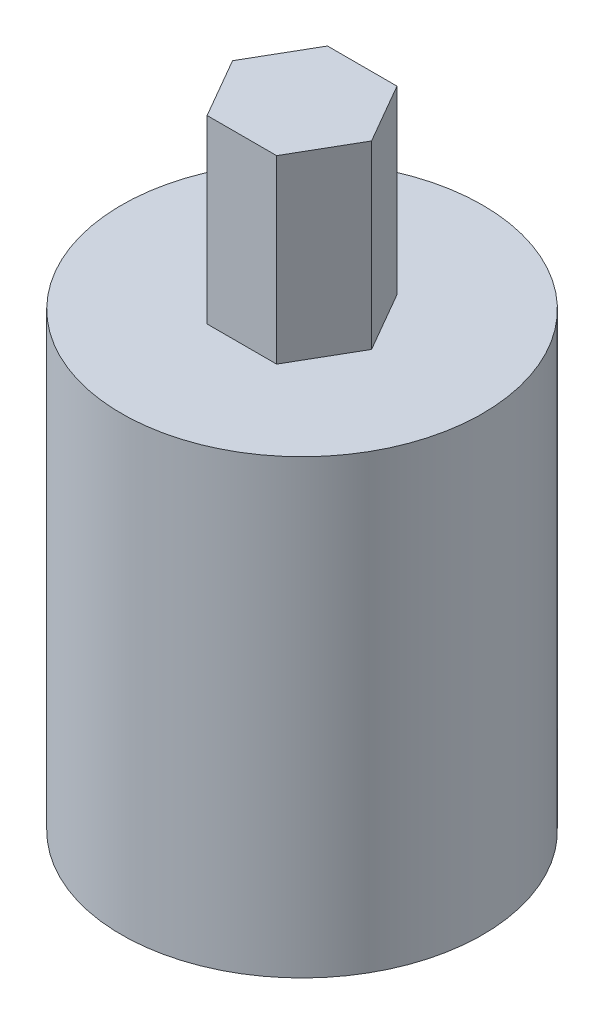
ISO-10303-21;
HEADER;
FILE_DESCRIPTION(('STEP AP214'),'2;1');
FILE_NAME('part.step','',(''),(''),'','','');
FILE_SCHEMA(('AUTOMOTIVE_DESIGN { 1 0 10303 214 1 1 1 1 }'));
ENDSEC;
DATA;
#1=APPLICATION_CONTEXT('core data for automotive mechanical design processes');
#2=APPLICATION_PROTOCOL_DEFINITION('international standard','automotive_design',2000,#1);
#3=PRODUCT_CONTEXT('',#1,'mechanical');
#4=PRODUCT('Part','Part','',(#3));
#5=PRODUCT_RELATED_PRODUCT_CATEGORY('part','',(#4));
#6=PRODUCT_DEFINITION_FORMATION('','',#4);
#7=PRODUCT_DEFINITION_CONTEXT('part definition',#1,'design');
#8=PRODUCT_DEFINITION('design','',#6,#7);
#9=PRODUCT_DEFINITION_SHAPE('','',#8);
#10=(LENGTH_UNIT() NAMED_UNIT(*) SI_UNIT(.MILLI.,.METRE.));
#11=(NAMED_UNIT(*) PLANE_ANGLE_UNIT() SI_UNIT($,.RADIAN.));
#12=(NAMED_UNIT(*) SI_UNIT($,.STERADIAN.) SOLID_ANGLE_UNIT());
#13=UNCERTAINTY_MEASURE_WITH_UNIT(LENGTH_MEASURE(1.E-05),#10,'distance_accuracy_value','');
#14=(GEOMETRIC_REPRESENTATION_CONTEXT(3) GLOBAL_UNCERTAINTY_ASSIGNED_CONTEXT((#13)) GLOBAL_UNIT_ASSIGNED_CONTEXT((#10,
#11,#12)) REPRESENTATION_CONTEXT('',''));
#15=CARTESIAN_POINT('',(0.,0.,0.));
#16=DIRECTION('',(0.,0.,1.));
#17=DIRECTION('',(1.,0.,0.));
#18=AXIS2_PLACEMENT_3D('',#15,#16,#17);
#19=CARTESIAN_POINT('',(0.,-7.5,0.));
#20=DIRECTION('',(0.,-1.,0.));
#21=DIRECTION('',(0.,0.,-1.));
#22=AXIS2_PLACEMENT_3D('',#19,#20,#21);
#23=PLANE('',#22);
#24=CARTESIAN_POINT('',(0.,-7.5,0.));
#25=DIRECTION('',(0.,-1.,0.));
#26=DIRECTION('',(0.,0.,-1.));
#27=AXIS2_PLACEMENT_3D('',#24,#25,#26);
#28=CIRCLE('',#27,3.);
#29=CARTESIAN_POINT('',(0.,-7.5,-3.));
#30=VERTEX_POINT('',#29);
#31=EDGE_CURVE('E14',#30,#30,#28,.T.);
#32=ORIENTED_EDGE('',*,*,#31,.T.);
#33=EDGE_LOOP('',(#32));
#34=FACE_BOUND('',#33,.T.);
#35=DIRECTION('',(0.,0.,-1.));
#36=VECTOR('',#35,1.);
#37=CARTESIAN_POINT('',(-1.13002976164114,-7.5,0.));
#38=LINE('',#37,#36);
#39=CARTESIAN_POINT('',(-1.13002976164114,-7.5,-1.13002976164114));
#40=VERTEX_POINT('',#39);
#41=CARTESIAN_POINT('',(-1.13002976164115,-7.5,-2.23002976164114));
#42=VERTEX_POINT('',#41);
#43=EDGE_CURVE('E252',#40,#42,#38,.T.);
#44=ORIENTED_EDGE('',*,*,#43,.F.);
#45=DIRECTION('',(-1.,0.,0.));
#46=VECTOR('',#45,1.);
#47=CARTESIAN_POINT('',(0.,-7.5,-1.13002976164114));
#48=LINE('',#47,#46);
#49=CARTESIAN_POINT('',(-2.23002976164115,-7.5,-1.13002976164114));
#50=VERTEX_POINT('',#49);
#51=EDGE_CURVE('E240',#40,#50,#48,.T.);
#52=ORIENTED_EDGE('',*,*,#51,.T.);
#53=CARTESIAN_POINT('',(0.,-7.5,0.));
#54=DIRECTION('',(0.,-1.,0.));
#55=DIRECTION('',(0.,0.,-1.));
#56=AXIS2_PLACEMENT_3D('',#53,#54,#55);
#57=CIRCLE('',#56,2.5);
#58=CARTESIAN_POINT('',(-2.23002976164115,-7.5,1.13002976164115));
#59=VERTEX_POINT('',#58);
#60=EDGE_CURVE('E310',#59,#50,#57,.T.);
#61=ORIENTED_EDGE('',*,*,#60,.F.);
#62=DIRECTION('',(-1.,0.,0.));
#63=VECTOR('',#62,1.);
#64=CARTESIAN_POINT('',(0.,-7.5,1.13002976164114));
#65=LINE('',#64,#63);
#66=CARTESIAN_POINT('',(-1.13002976164114,-7.5,1.13002976164114));
#67=VERTEX_POINT('',#66);
#68=EDGE_CURVE('E239',#67,#59,#65,.T.);
#69=ORIENTED_EDGE('',*,*,#68,.F.);
#70=CARTESIAN_POINT('',(-1.13002976164114,-7.5,2.23002976164114));
#71=VERTEX_POINT('',#70);
#72=EDGE_CURVE('E235',#71,#67,#38,.T.);
#73=ORIENTED_EDGE('',*,*,#72,.F.);
#74=CARTESIAN_POINT('',(0.,-7.5,0.));
#75=DIRECTION('',(0.,-1.,0.));
#76=DIRECTION('',(0.,0.,-1.));
#77=AXIS2_PLACEMENT_3D('',#74,#75,#76);
#78=CIRCLE('',#77,2.5);
#79=CARTESIAN_POINT('',(1.13002976164114,-7.5,2.23002976164114));
#80=VERTEX_POINT('',#79);
#81=EDGE_CURVE('E305',#80,#71,#78,.T.);
#82=ORIENTED_EDGE('',*,*,#81,.F.);
#83=DIRECTION('',(0.,0.,-1.));
#84=VECTOR('',#83,1.);
#85=CARTESIAN_POINT('',(1.13002976164114,-7.5,0.));
#86=LINE('',#85,#84);
#87=CARTESIAN_POINT('',(1.13002976164114,-7.5,1.13002976164114));
#88=VERTEX_POINT('',#87);
#89=EDGE_CURVE('E234',#80,#88,#86,.T.);
#90=ORIENTED_EDGE('',*,*,#89,.T.);
#91=CARTESIAN_POINT('',(2.23002976164114,-7.5,1.13002976164114));
#92=VERTEX_POINT('',#91);
#93=EDGE_CURVE('E140',#92,#88,#65,.T.);
#94=ORIENTED_EDGE('',*,*,#93,.F.);
#95=CARTESIAN_POINT('',(0.,-7.5,0.));
#96=DIRECTION('',(0.,-1.,0.));
#97=DIRECTION('',(0.,0.,-1.));
#98=AXIS2_PLACEMENT_3D('',#95,#96,#97);
#99=CIRCLE('',#98,2.5);
#100=CARTESIAN_POINT('',(2.23002976164114,-7.5,-1.13002976164114));
#101=VERTEX_POINT('',#100);
#102=EDGE_CURVE('E224',#101,#92,#99,.T.);
#103=ORIENTED_EDGE('',*,*,#102,.F.);
#104=CARTESIAN_POINT('',(1.13002976164114,-7.5,-1.13002976164114));
#105=VERTEX_POINT('',#104);
#106=EDGE_CURVE('E217',#101,#105,#48,.T.);
#107=ORIENTED_EDGE('',*,*,#106,.T.);
#108=CARTESIAN_POINT('',(1.13002976164115,-7.5,-2.23002976164114));
#109=VERTEX_POINT('',#108);
#110=EDGE_CURVE('E228',#105,#109,#86,.T.);
#111=ORIENTED_EDGE('',*,*,#110,.T.);
#112=CARTESIAN_POINT('',(0.,-7.5,0.));
#113=DIRECTION('',(0.,-1.,0.));
#114=DIRECTION('',(0.,0.,-1.));
#115=AXIS2_PLACEMENT_3D('',#112,#113,#114);
#116=CIRCLE('',#115,2.5);
#117=EDGE_CURVE('E318',#42,#109,#116,.T.);
#118=ORIENTED_EDGE('',*,*,#117,.F.);
#119=EDGE_LOOP('',(#44,#52,#61,#69,#73,#82,#90,#94,#103,#107,#111,#118));
#120=FACE_BOUND('',#119,.T.);
#121=ADVANCED_FACE('F125',(#34,#120),#23,.T.);
#122=CARTESIAN_POINT('',(0.,-7.5,0.));
#123=DIRECTION('',(0.,1.,0.));
#124=DIRECTION('',(0.,0.,1.));
#125=AXIS2_PLACEMENT_3D('',#122,#123,#124);
#126=CYLINDRICAL_SURFACE('',#125,3.);
#127=ORIENTED_EDGE('',*,*,#31,.F.);
#128=EDGE_LOOP('',(#127));
#129=FACE_BOUND('',#128,.T.);
#130=CARTESIAN_POINT('',(0.,0.,0.));
#131=DIRECTION('',(0.,-1.,0.));
#132=DIRECTION('',(0.,0.,-1.));
#133=AXIS2_PLACEMENT_3D('',#130,#131,#132);
#134=CIRCLE('',#133,3.);
#135=CARTESIAN_POINT('',(0.,0.,-3.));
#136=VERTEX_POINT('',#135);
#137=EDGE_CURVE('E129',#136,#136,#134,.T.);
#138=ORIENTED_EDGE('',*,*,#137,.T.);
#139=EDGE_LOOP('',(#138));
#140=FACE_BOUND('',#139,.T.);
#141=ADVANCED_FACE('F127',(#129,#140),#126,.T.);
#142=CARTESIAN_POINT('',(0.,0.,0.));
#143=DIRECTION('',(0.,-1.,0.));
#144=DIRECTION('',(0.,0.,-1.));
#145=AXIS2_PLACEMENT_3D('',#142,#143,#144);
#146=PLANE('',#145);
#147=ORIENTED_EDGE('',*,*,#137,.F.);
#148=EDGE_LOOP('',(#147));
#149=FACE_BOUND('',#148,.T.);
#150=ADVANCED_FACE('F345',(#149),#146,.F.);
#151=CARTESIAN_POINT('',(0.,5.,0.));
#152=DIRECTION('',(0.,-1.,0.));
#153=DIRECTION('',(0.,0.,-1.));
#154=AXIS2_PLACEMENT_3D('',#151,#152,#153);
#155=CYLINDRICAL_SURFACE('',#154,2.5);
#156=CARTESIAN_POINT('',(0.,-1.,0.));
#157=DIRECTION('',(0.,-1.,0.));
#158=DIRECTION('',(0.,0.,-1.));
#159=AXIS2_PLACEMENT_3D('',#156,#157,#158);
#160=CIRCLE('',#159,2.5);
#161=CARTESIAN_POINT('',(-1.13002976164114,-1.,2.23002976164114));
#162=VERTEX_POINT('',#161);
#163=CARTESIAN_POINT('',(1.13002976164114,-1.,2.23002976164114));
#164=VERTEX_POINT('',#163);
#165=EDGE_CURVE('E293',#162,#164,#160,.F.);
#166=ORIENTED_EDGE('',*,*,#165,.T.);
#167=DIRECTION('',(0.,-1.,0.));
#168=VECTOR('',#167,1.);
#169=CARTESIAN_POINT('',(1.13002976164114,5.,2.23002976164114));
#170=LINE('',#169,#168);
#171=EDGE_CURVE('E299',#164,#80,#170,.T.);
#172=ORIENTED_EDGE('',*,*,#171,.T.);
#173=ORIENTED_EDGE('',*,*,#81,.T.);
#174=DIRECTION('',(0.,-1.,0.));
#175=VECTOR('',#174,1.);
#176=CARTESIAN_POINT('',(-1.13002976164114,5.,2.23002976164114));
#177=LINE('',#176,#175);
#178=EDGE_CURVE('E149',#162,#71,#177,.T.);
#179=ORIENTED_EDGE('',*,*,#178,.F.);
#180=EDGE_LOOP('',(#166,#172,#173,#179));
#181=FACE_BOUND('',#180,.T.);
#182=ADVANCED_FACE('F298',(#181),#155,.F.);
#183=CARTESIAN_POINT('',(0.,-1.,0.));
#184=DIRECTION('',(0.,-1.,0.));
#185=DIRECTION('',(0.,0.,-1.));
#186=AXIS2_PLACEMENT_3D('',#183,#184,#185);
#187=PLANE('',#186);
#188=ORIENTED_EDGE('',*,*,#165,.F.);
#189=DIRECTION('',(0.,0.,1.));
#190=VECTOR('',#189,1.);
#191=CARTESIAN_POINT('',(-1.13002976164114,-1.,0.));
#192=LINE('',#191,#190);
#193=CARTESIAN_POINT('',(-1.13002976164114,-1.,1.13002976164114));
#194=VERTEX_POINT('',#193);
#195=EDGE_CURVE('E279',#194,#162,#192,.T.);
#196=ORIENTED_EDGE('',*,*,#195,.F.);
#197=DIRECTION('',(1.,0.,0.));
#198=VECTOR('',#197,1.);
#199=CARTESIAN_POINT('',(0.,-1.,1.13002976164114));
#200=LINE('',#199,#198);
#201=CARTESIAN_POINT('',(-2.23002976164115,-1.,1.13002976164115));
#202=VERTEX_POINT('',#201);
#203=EDGE_CURVE('E249',#202,#194,#200,.T.);
#204=ORIENTED_EDGE('',*,*,#203,.F.);
#205=CARTESIAN_POINT('',(0.,-1.,0.));
#206=DIRECTION('',(0.,-1.,0.));
#207=DIRECTION('',(0.,0.,-1.));
#208=AXIS2_PLACEMENT_3D('',#205,#206,#207);
#209=CIRCLE('',#208,2.5);
#210=CARTESIAN_POINT('',(-2.23002976164115,-1.,-1.13002976164114));
#211=VERTEX_POINT('',#210);
#212=EDGE_CURVE('E276',#211,#202,#209,.F.);
#213=ORIENTED_EDGE('',*,*,#212,.F.);
#214=DIRECTION('',(1.,0.,0.));
#215=VECTOR('',#214,1.);
#216=CARTESIAN_POINT('',(0.,-1.,-1.13002976164114));
#217=LINE('',#216,#215);
#218=CARTESIAN_POINT('',(-1.13002976164114,-1.,-1.13002976164114));
#219=VERTEX_POINT('',#218);
#220=EDGE_CURVE('E246',#211,#219,#217,.T.);
#221=ORIENTED_EDGE('',*,*,#220,.T.);
#222=CARTESIAN_POINT('',(-1.13002976164115,-1.,-2.23002976164114));
#223=VERTEX_POINT('',#222);
#224=EDGE_CURVE('E257',#223,#219,#192,.T.);
#225=ORIENTED_EDGE('',*,*,#224,.F.);
#226=CARTESIAN_POINT('',(0.,-1.,0.));
#227=DIRECTION('',(0.,-1.,0.));
#228=DIRECTION('',(0.,0.,-1.));
#229=AXIS2_PLACEMENT_3D('',#226,#227,#228);
#230=CIRCLE('',#229,2.5);
#231=CARTESIAN_POINT('',(1.13002976164115,-1.,-2.23002976164114));
#232=VERTEX_POINT('',#231);
#233=EDGE_CURVE('E314',#232,#223,#230,.F.);
#234=ORIENTED_EDGE('',*,*,#233,.F.);
#235=DIRECTION('',(0.,0.,1.));
#236=VECTOR('',#235,1.);
#237=CARTESIAN_POINT('',(1.13002976164114,-1.,0.));
#238=LINE('',#237,#236);
#239=CARTESIAN_POINT('',(1.13002976164114,-1.,-1.13002976164114));
#240=VERTEX_POINT('',#239);
#241=EDGE_CURVE('E281',#232,#240,#238,.T.);
#242=ORIENTED_EDGE('',*,*,#241,.T.);
#243=CARTESIAN_POINT('',(2.23002976164114,-1.,-1.13002976164114));
#244=VERTEX_POINT('',#243);
#245=EDGE_CURVE('E220',#240,#244,#217,.T.);
#246=ORIENTED_EDGE('',*,*,#245,.T.);
#247=CARTESIAN_POINT('',(0.,-1.,0.));
#248=DIRECTION('',(0.,-1.,0.));
#249=DIRECTION('',(0.,0.,-1.));
#250=AXIS2_PLACEMENT_3D('',#247,#248,#249);
#251=CIRCLE('',#250,2.5);
#252=CARTESIAN_POINT('',(2.23002976164114,-1.,1.13002976164114));
#253=VERTEX_POINT('',#252);
#254=EDGE_CURVE('E320',#253,#244,#251,.F.);
#255=ORIENTED_EDGE('',*,*,#254,.F.);
#256=CARTESIAN_POINT('',(1.13002976164114,-1.,1.13002976164114));
#257=VERTEX_POINT('',#256);
#258=EDGE_CURVE('E253',#257,#253,#200,.T.);
#259=ORIENTED_EDGE('',*,*,#258,.F.);
#260=EDGE_CURVE('E288',#257,#164,#238,.T.);
#261=ORIENTED_EDGE('',*,*,#260,.T.);
#262=EDGE_LOOP('',(#188,#196,#204,#213,#221,#225,#234,#242,#246,#255,#259,#261));
#263=FACE_BOUND('',#262,.T.);
#264=ADVANCED_FACE('F271',(#263),#187,.T.);
#265=CARTESIAN_POINT('',(0.,5.,0.));
#266=DIRECTION('',(0.,-1.,0.));
#267=DIRECTION('',(0.,0.,-1.));
#268=AXIS2_PLACEMENT_3D('',#265,#266,#267);
#269=CYLINDRICAL_SURFACE('',#268,2.5);
#270=ORIENTED_EDGE('',*,*,#233,.T.);
#271=DIRECTION('',(0.,-1.,0.));
#272=VECTOR('',#271,1.);
#273=CARTESIAN_POINT('',(-1.13002976164115,5.,-2.23002976164114));
#274=LINE('',#273,#272);
#275=EDGE_CURVE('E278',#223,#42,#274,.T.);
#276=ORIENTED_EDGE('',*,*,#275,.T.);
#277=ORIENTED_EDGE('',*,*,#117,.T.);
#278=DIRECTION('',(0.,-1.,0.));
#279=VECTOR('',#278,1.);
#280=CARTESIAN_POINT('',(1.13002976164115,5.,-2.23002976164114));
#281=LINE('',#280,#279);
#282=EDGE_CURVE('E230',#232,#109,#281,.T.);
#283=ORIENTED_EDGE('',*,*,#282,.F.);
#284=EDGE_LOOP('',(#270,#276,#277,#283));
#285=FACE_BOUND('',#284,.T.);
#286=ADVANCED_FACE('F342',(#285),#269,.F.);
#287=CARTESIAN_POINT('',(0.,5.,-1.13002976164114));
#288=DIRECTION('',(0.,0.,1.));
#289=DIRECTION('',(1.,0.,0.));
#290=AXIS2_PLACEMENT_3D('',#287,#288,#289);
#291=PLANE('',#290);
#292=DIRECTION('',(0.,1.,0.));
#293=VECTOR('',#292,1.);
#294=CARTESIAN_POINT('',(-1.13002976164114,5.,-1.13002976164114));
#295=LINE('',#294,#293);
#296=EDGE_CURVE('E256',#40,#219,#295,.T.);
#297=ORIENTED_EDGE('',*,*,#296,.T.);
#298=ORIENTED_EDGE('',*,*,#220,.F.);
#299=DIRECTION('',(0.,-1.,0.));
#300=VECTOR('',#299,1.);
#301=CARTESIAN_POINT('',(-2.23002976164115,5.,-1.13002976164114));
#302=LINE('',#301,#300);
#303=EDGE_CURVE('E313',#211,#50,#302,.T.);
#304=ORIENTED_EDGE('',*,*,#303,.T.);
#305=ORIENTED_EDGE('',*,*,#51,.F.);
#306=EDGE_LOOP('',(#297,#298,#304,#305));
#307=FACE_BOUND('',#306,.T.);
#308=ADVANCED_FACE('F263',(#307),#291,.T.);
#309=CARTESIAN_POINT('',(-1.13002976164114,5.,0.));
#310=DIRECTION('',(-1.,0.,0.));
#311=DIRECTION('',(0.,0.,1.));
#312=AXIS2_PLACEMENT_3D('',#309,#310,#311);
#313=PLANE('',#312);
#314=ORIENTED_EDGE('',*,*,#43,.T.);
#315=ORIENTED_EDGE('',*,*,#275,.F.);
#316=ORIENTED_EDGE('',*,*,#224,.T.);
#317=ORIENTED_EDGE('',*,*,#296,.F.);
#318=EDGE_LOOP('',(#314,#315,#316,#317));
#319=FACE_BOUND('',#318,.T.);
#320=ADVANCED_FACE('F277',(#319),#313,.F.);
#321=CARTESIAN_POINT('',(1.13002976164114,5.,0.));
#322=DIRECTION('',(-1.,0.,0.));
#323=DIRECTION('',(0.,0.,1.));
#324=AXIS2_PLACEMENT_3D('',#321,#322,#323);
#325=PLANE('',#324);
#326=DIRECTION('',(0.,1.,0.));
#327=VECTOR('',#326,1.);
#328=CARTESIAN_POINT('',(1.13002976164114,5.,-1.13002976164114));
#329=LINE('',#328,#327);
#330=EDGE_CURVE('E213',#105,#240,#329,.T.);
#331=ORIENTED_EDGE('',*,*,#330,.T.);
#332=ORIENTED_EDGE('',*,*,#241,.F.);
#333=ORIENTED_EDGE('',*,*,#282,.T.);
#334=ORIENTED_EDGE('',*,*,#110,.F.);
#335=EDGE_LOOP('',(#331,#332,#333,#334));
#336=FACE_BOUND('',#335,.T.);
#337=ADVANCED_FACE('F229',(#336),#325,.T.);
#338=ORIENTED_EDGE('',*,*,#106,.F.);
#339=DIRECTION('',(0.,-1.,0.));
#340=VECTOR('',#339,1.);
#341=CARTESIAN_POINT('',(2.23002976164114,5.,-1.13002976164114));
#342=LINE('',#341,#340);
#343=EDGE_CURVE('E325',#244,#101,#342,.T.);
#344=ORIENTED_EDGE('',*,*,#343,.F.);
#345=ORIENTED_EDGE('',*,*,#245,.F.);
#346=ORIENTED_EDGE('',*,*,#330,.F.);
#347=EDGE_LOOP('',(#338,#344,#345,#346));
#348=FACE_BOUND('',#347,.T.);
#349=ADVANCED_FACE('F215',(#348),#291,.T.);
#350=CARTESIAN_POINT('',(0.,5.,0.));
#351=DIRECTION('',(0.,-1.,0.));
#352=DIRECTION('',(0.,0.,-1.));
#353=AXIS2_PLACEMENT_3D('',#350,#351,#352);
#354=CYLINDRICAL_SURFACE('',#353,2.5);
#355=ORIENTED_EDGE('',*,*,#254,.T.);
#356=ORIENTED_EDGE('',*,*,#343,.T.);
#357=ORIENTED_EDGE('',*,*,#102,.T.);
#358=DIRECTION('',(0.,-1.,0.));
#359=VECTOR('',#358,1.);
#360=CARTESIAN_POINT('',(2.23002976164114,5.,1.13002976164114));
#361=LINE('',#360,#359);
#362=EDGE_CURVE('E284',#253,#92,#361,.T.);
#363=ORIENTED_EDGE('',*,*,#362,.F.);
#364=EDGE_LOOP('',(#355,#356,#357,#363));
#365=FACE_BOUND('',#364,.T.);
#366=ADVANCED_FACE('F328',(#365),#354,.F.);
#367=CARTESIAN_POINT('',(0.,5.,0.));
#368=DIRECTION('',(0.,-1.,0.));
#369=DIRECTION('',(0.,0.,-1.));
#370=AXIS2_PLACEMENT_3D('',#367,#368,#369);
#371=CYLINDRICAL_SURFACE('',#370,2.5);
#372=ORIENTED_EDGE('',*,*,#212,.T.);
#373=DIRECTION('',(0.,-1.,0.));
#374=VECTOR('',#373,1.);
#375=CARTESIAN_POINT('',(-2.23002976164115,5.,1.13002976164115));
#376=LINE('',#375,#374);
#377=EDGE_CURVE('E309',#202,#59,#376,.T.);
#378=ORIENTED_EDGE('',*,*,#377,.T.);
#379=ORIENTED_EDGE('',*,*,#60,.T.);
#380=ORIENTED_EDGE('',*,*,#303,.F.);
#381=EDGE_LOOP('',(#372,#378,#379,#380));
#382=FACE_BOUND('',#381,.T.);
#383=ADVANCED_FACE('F340',(#382),#371,.F.);
#384=CARTESIAN_POINT('',(0.,5.,1.13002976164114));
#385=DIRECTION('',(0.,0.,1.));
#386=DIRECTION('',(1.,0.,0.));
#387=AXIS2_PLACEMENT_3D('',#384,#385,#386);
#388=PLANE('',#387);
#389=DIRECTION('',(0.,1.,0.));
#390=VECTOR('',#389,1.);
#391=CARTESIAN_POINT('',(1.13002976164114,5.,1.13002976164114));
#392=LINE('',#391,#390);
#393=EDGE_CURVE('E225',#88,#257,#392,.T.);
#394=ORIENTED_EDGE('',*,*,#393,.T.);
#395=ORIENTED_EDGE('',*,*,#258,.T.);
#396=ORIENTED_EDGE('',*,*,#362,.T.);
#397=ORIENTED_EDGE('',*,*,#93,.T.);
#398=EDGE_LOOP('',(#394,#395,#396,#397));
#399=FACE_BOUND('',#398,.T.);
#400=ADVANCED_FACE('F327',(#399),#388,.F.);
#401=ORIENTED_EDGE('',*,*,#68,.T.);
#402=ORIENTED_EDGE('',*,*,#377,.F.);
#403=ORIENTED_EDGE('',*,*,#203,.T.);
#404=DIRECTION('',(0.,1.,0.));
#405=VECTOR('',#404,1.);
#406=CARTESIAN_POINT('',(-1.13002976164114,5.,1.13002976164114));
#407=LINE('',#406,#405);
#408=EDGE_CURVE('E254',#67,#194,#407,.T.);
#409=ORIENTED_EDGE('',*,*,#408,.F.);
#410=EDGE_LOOP('',(#401,#402,#403,#409));
#411=FACE_BOUND('',#410,.T.);
#412=ADVANCED_FACE('F338',(#411),#388,.F.);
#413=ORIENTED_EDGE('',*,*,#408,.T.);
#414=ORIENTED_EDGE('',*,*,#195,.T.);
#415=ORIENTED_EDGE('',*,*,#178,.T.);
#416=ORIENTED_EDGE('',*,*,#72,.T.);
#417=EDGE_LOOP('',(#413,#414,#415,#416));
#418=FACE_BOUND('',#417,.T.);
#419=ADVANCED_FACE('F334',(#418),#313,.F.);
#420=ORIENTED_EDGE('',*,*,#89,.F.);
#421=ORIENTED_EDGE('',*,*,#171,.F.);
#422=ORIENTED_EDGE('',*,*,#260,.F.);
#423=ORIENTED_EDGE('',*,*,#393,.F.);
#424=EDGE_LOOP('',(#420,#421,#422,#423));
#425=FACE_BOUND('',#424,.T.);
#426=ADVANCED_FACE('F331',(#425),#325,.T.);
#427=CLOSED_SHELL('',(#121,#141,#150,#182,#264,#286,#308,#320,#337,#349,#366,#383,#400,#412,
#419,#426));
#428=MANIFOLD_SOLID_BREP('B2',#427);
#429=CARTESIAN_POINT('',(0.577350269189624,3.,-1.));
#430=DIRECTION('',(0.,0.,1.));
#431=DIRECTION('',(1.,0.,0.));
#432=AXIS2_PLACEMENT_3D('',#429,#430,#431);
#433=PLANE('',#432);
#434=DIRECTION('',(-1.,0.,0.));
#435=VECTOR('',#434,1.);
#436=CARTESIAN_POINT('',(0.577350269189624,0.,-1.));
#437=LINE('',#436,#435);
#438=CARTESIAN_POINT('',(0.577350269189624,0.,-1.));
#439=VERTEX_POINT('',#438);
#440=CARTESIAN_POINT('',(-0.577350269189623,0.,-1.));
#441=VERTEX_POINT('',#440);
#442=EDGE_CURVE('E559',#439,#441,#437,.T.);
#443=ORIENTED_EDGE('',*,*,#442,.T.);
#444=DIRECTION('',(0.,-1.,0.));
#445=VECTOR('',#444,1.);
#446=CARTESIAN_POINT('',(-0.577350269189623,3.,-1.));
#447=LINE('',#446,#445);
#448=CARTESIAN_POINT('',(-0.577350269189623,3.,-1.));
#449=VERTEX_POINT('',#448);
#450=EDGE_CURVE('E123',#449,#441,#447,.T.);
#451=ORIENTED_EDGE('',*,*,#450,.F.);
#452=DIRECTION('',(-1.,0.,0.));
#453=VECTOR('',#452,1.);
#454=CARTESIAN_POINT('',(0.577350269189624,3.,-1.));
#455=LINE('',#454,#453);
#456=CARTESIAN_POINT('',(0.577350269189624,3.,-1.));
#457=VERTEX_POINT('',#456);
#458=EDGE_CURVE('E569',#457,#449,#455,.T.);
#459=ORIENTED_EDGE('',*,*,#458,.F.);
#460=DIRECTION('',(0.,-1.,0.));
#461=VECTOR('',#460,1.);
#462=CARTESIAN_POINT('',(0.577350269189624,3.,-1.));
#463=LINE('',#462,#461);
#464=EDGE_CURVE('E555',#457,#439,#463,.T.);
#465=ORIENTED_EDGE('',*,*,#464,.T.);
#466=EDGE_LOOP('',(#443,#451,#459,#465));
#467=FACE_BOUND('',#466,.T.);
#468=ADVANCED_FACE('F475',(#467),#433,.F.);
#469=CARTESIAN_POINT('',(-0.577350269189623,3.,-1.));
#470=DIRECTION('',(0.866025403784439,0.,0.5));
#471=DIRECTION('',(0.5,0.,-0.866025403784439));
#472=AXIS2_PLACEMENT_3D('',#469,#470,#471);
#473=PLANE('',#472);
#474=DIRECTION('',(-0.5,0.,0.866025403784439));
#475=VECTOR('',#474,1.);
#476=CARTESIAN_POINT('',(-0.577350269189623,0.,-1.));
#477=LINE('',#476,#475);
#478=CARTESIAN_POINT('',(-1.15470053837925,0.,0.));
#479=VERTEX_POINT('',#478);
#480=EDGE_CURVE('E562',#441,#479,#477,.T.);
#481=ORIENTED_EDGE('',*,*,#480,.T.);
#482=DIRECTION('',(0.,-1.,0.));
#483=VECTOR('',#482,1.);
#484=CARTESIAN_POINT('',(-1.15470053837925,3.,0.));
#485=LINE('',#484,#483);
#486=CARTESIAN_POINT('',(-1.15470053837925,3.,0.));
#487=VERTEX_POINT('',#486);
#488=EDGE_CURVE('E483',#487,#479,#485,.T.);
#489=ORIENTED_EDGE('',*,*,#488,.F.);
#490=DIRECTION('',(-0.5,0.,0.866025403784439));
#491=VECTOR('',#490,1.);
#492=CARTESIAN_POINT('',(-0.577350269189623,3.,-1.));
#493=LINE('',#492,#491);
#494=EDGE_CURVE('E528',#449,#487,#493,.T.);
#495=ORIENTED_EDGE('',*,*,#494,.F.);
#496=ORIENTED_EDGE('',*,*,#450,.T.);
#497=EDGE_LOOP('',(#481,#489,#495,#496));
#498=FACE_BOUND('',#497,.T.);
#499=ADVANCED_FACE('F593',(#498),#473,.F.);
#500=CARTESIAN_POINT('',(-1.15470053837925,3.,0.));
#501=DIRECTION('',(0.866025403784439,0.,-0.5));
#502=DIRECTION('',(-0.5,0.,-0.866025403784439));
#503=AXIS2_PLACEMENT_3D('',#500,#501,#502);
#504=PLANE('',#503);
#505=DIRECTION('',(0.5,0.,0.866025403784438));
#506=VECTOR('',#505,1.);
#507=CARTESIAN_POINT('',(-1.15470053837925,0.,0.));
#508=LINE('',#507,#506);
#509=CARTESIAN_POINT('',(-0.577350269189619,0.,0.999999999999997));
#510=VERTEX_POINT('',#509);
#511=EDGE_CURVE('E564',#479,#510,#508,.T.);
#512=ORIENTED_EDGE('',*,*,#511,.T.);
#513=DIRECTION('',(0.,-1.,0.));
#514=VECTOR('',#513,1.);
#515=CARTESIAN_POINT('',(-0.577350269189619,3.,0.999999999999997));
#516=LINE('',#515,#514);
#517=CARTESIAN_POINT('',(-0.577350269189619,3.,0.999999999999997));
#518=VERTEX_POINT('',#517);
#519=EDGE_CURVE('E550',#518,#510,#516,.T.);
#520=ORIENTED_EDGE('',*,*,#519,.F.);
#521=DIRECTION('',(0.5,0.,0.866025403784438));
#522=VECTOR('',#521,1.);
#523=CARTESIAN_POINT('',(-1.15470053837925,3.,0.));
#524=LINE('',#523,#522);
#525=EDGE_CURVE('E541',#487,#518,#524,.T.);
#526=ORIENTED_EDGE('',*,*,#525,.F.);
#527=ORIENTED_EDGE('',*,*,#488,.T.);
#528=EDGE_LOOP('',(#512,#520,#526,#527));
#529=FACE_BOUND('',#528,.T.);
#530=ADVANCED_FACE('F575',(#529),#504,.F.);
#531=CARTESIAN_POINT('',(-0.577350269189619,3.,0.999999999999997));
#532=DIRECTION('',(0.,0.,-1.));
#533=DIRECTION('',(-1.,0.,0.));
#534=AXIS2_PLACEMENT_3D('',#531,#532,#533);
#535=PLANE('',#534);
#536=DIRECTION('',(1.,0.,0.));
#537=VECTOR('',#536,1.);
#538=CARTESIAN_POINT('',(-0.577350269189619,0.,0.999999999999997));
#539=LINE('',#538,#537);
#540=CARTESIAN_POINT('',(0.577350269189625,0.,0.999999999999996));
#541=VERTEX_POINT('',#540);
#542=EDGE_CURVE('E549',#510,#541,#539,.T.);
#543=ORIENTED_EDGE('',*,*,#542,.T.);
#544=DIRECTION('',(0.,-1.,0.));
#545=VECTOR('',#544,1.);
#546=CARTESIAN_POINT('',(0.577350269189625,3.,0.999999999999996));
#547=LINE('',#546,#545);
#548=CARTESIAN_POINT('',(0.577350269189625,3.,0.999999999999996));
#549=VERTEX_POINT('',#548);
#550=EDGE_CURVE('E546',#549,#541,#547,.T.);
#551=ORIENTED_EDGE('',*,*,#550,.F.);
#552=DIRECTION('',(1.,0.,0.));
#553=VECTOR('',#552,1.);
#554=CARTESIAN_POINT('',(-0.577350269189619,3.,0.999999999999997));
#555=LINE('',#554,#553);
#556=EDGE_CURVE('E535',#518,#549,#555,.T.);
#557=ORIENTED_EDGE('',*,*,#556,.F.);
#558=ORIENTED_EDGE('',*,*,#519,.T.);
#559=EDGE_LOOP('',(#543,#551,#557,#558));
#560=FACE_BOUND('',#559,.T.);
#561=ADVANCED_FACE('F547',(#560),#535,.F.);
#562=CARTESIAN_POINT('',(0.577350269189625,3.,0.999999999999996));
#563=DIRECTION('',(-0.866025403784439,0.,-0.499999999999999));
#564=DIRECTION('',(-0.499999999999999,0.,0.866025403784439));
#565=AXIS2_PLACEMENT_3D('',#562,#563,#564);
#566=PLANE('',#565);
#567=DIRECTION('',(0.499999999999999,0.,-0.866025403784439));
#568=VECTOR('',#567,1.);
#569=CARTESIAN_POINT('',(0.577350269189625,0.,0.999999999999996));
#570=LINE('',#569,#568);
#571=CARTESIAN_POINT('',(1.15470053837925,0.,0.));
#572=VERTEX_POINT('',#571);
#573=EDGE_CURVE('E514',#541,#572,#570,.T.);
#574=ORIENTED_EDGE('',*,*,#573,.T.);
#575=DIRECTION('',(0.,-1.,0.));
#576=VECTOR('',#575,1.);
#577=CARTESIAN_POINT('',(1.15470053837925,3.,0.));
#578=LINE('',#577,#576);
#579=CARTESIAN_POINT('',(1.15470053837925,3.,0.));
#580=VERTEX_POINT('',#579);
#581=EDGE_CURVE('E551',#580,#572,#578,.T.);
#582=ORIENTED_EDGE('',*,*,#581,.F.);
#583=DIRECTION('',(0.499999999999999,0.,-0.866025403784439));
#584=VECTOR('',#583,1.);
#585=CARTESIAN_POINT('',(0.577350269189625,3.,0.999999999999996));
#586=LINE('',#585,#584);
#587=EDGE_CURVE('E539',#549,#580,#586,.T.);
#588=ORIENTED_EDGE('',*,*,#587,.F.);
#589=ORIENTED_EDGE('',*,*,#550,.T.);
#590=EDGE_LOOP('',(#574,#582,#588,#589));
#591=FACE_BOUND('',#590,.T.);
#592=ADVANCED_FACE('F553',(#591),#566,.F.);
#593=CARTESIAN_POINT('',(1.15470053837925,3.,0.));
#594=DIRECTION('',(-0.866025403784438,0.,0.500000000000001));
#595=DIRECTION('',(0.500000000000001,0.,0.866025403784438));
#596=AXIS2_PLACEMENT_3D('',#593,#594,#595);
#597=PLANE('',#596);
#598=DIRECTION('',(-0.500000000000001,0.,-0.866025403784438));
#599=VECTOR('',#598,1.);
#600=CARTESIAN_POINT('',(1.15470053837925,0.,0.));
#601=LINE('',#600,#599);
#602=EDGE_CURVE('E520',#572,#439,#601,.T.);
#603=ORIENTED_EDGE('',*,*,#602,.T.);
#604=ORIENTED_EDGE('',*,*,#464,.F.);
#605=DIRECTION('',(-0.500000000000001,0.,-0.866025403784438));
#606=VECTOR('',#605,1.);
#607=CARTESIAN_POINT('',(1.15470053837925,3.,0.));
#608=LINE('',#607,#606);
#609=EDGE_CURVE('E491',#580,#457,#608,.T.);
#610=ORIENTED_EDGE('',*,*,#609,.F.);
#611=ORIENTED_EDGE('',*,*,#581,.T.);
#612=EDGE_LOOP('',(#603,#604,#610,#611));
#613=FACE_BOUND('',#612,.T.);
#614=ADVANCED_FACE('F582',(#613),#597,.F.);
#615=CARTESIAN_POINT('',(0.,3.,0.));
#616=DIRECTION('',(0.,1.,0.));
#617=DIRECTION('',(0.,0.,1.));
#618=AXIS2_PLACEMENT_3D('',#615,#616,#617);
#619=PLANE('',#618);
#620=ORIENTED_EDGE('',*,*,#458,.T.);
#621=ORIENTED_EDGE('',*,*,#494,.T.);
#622=ORIENTED_EDGE('',*,*,#525,.T.);
#623=ORIENTED_EDGE('',*,*,#556,.T.);
#624=ORIENTED_EDGE('',*,*,#587,.T.);
#625=ORIENTED_EDGE('',*,*,#609,.T.);
#626=EDGE_LOOP('',(#620,#621,#622,#623,#624,#625));
#627=FACE_BOUND('',#626,.T.);
#628=ADVANCED_FACE('F537',(#627),#619,.T.);
#629=CARTESIAN_POINT('',(0.,0.,0.));
#630=DIRECTION('',(0.,1.,0.));
#631=DIRECTION('',(0.,0.,1.));
#632=AXIS2_PLACEMENT_3D('',#629,#630,#631);
#633=PLANE('',#632);
#634=ORIENTED_EDGE('',*,*,#442,.F.);
#635=ORIENTED_EDGE('',*,*,#602,.F.);
#636=ORIENTED_EDGE('',*,*,#573,.F.);
#637=ORIENTED_EDGE('',*,*,#542,.F.);
#638=ORIENTED_EDGE('',*,*,#511,.F.);
#639=ORIENTED_EDGE('',*,*,#480,.F.);
#640=EDGE_LOOP('',(#634,#635,#636,#637,#638,#639));
#641=FACE_BOUND('',#640,.T.);
#642=ADVANCED_FACE('F578',(#641),#633,.F.);
#643=CLOSED_SHELL('',(#468,#499,#530,#561,#592,#614,#628,#642));
#644=MANIFOLD_SOLID_BREP('B8',#643);
#645=ADVANCED_BREP_SHAPE_REPRESENTATION('',(#18,#428,#644),#14);
#646=SHAPE_DEFINITION_REPRESENTATION(#9,#645);
ENDSEC;
END-ISO-10303-21;
